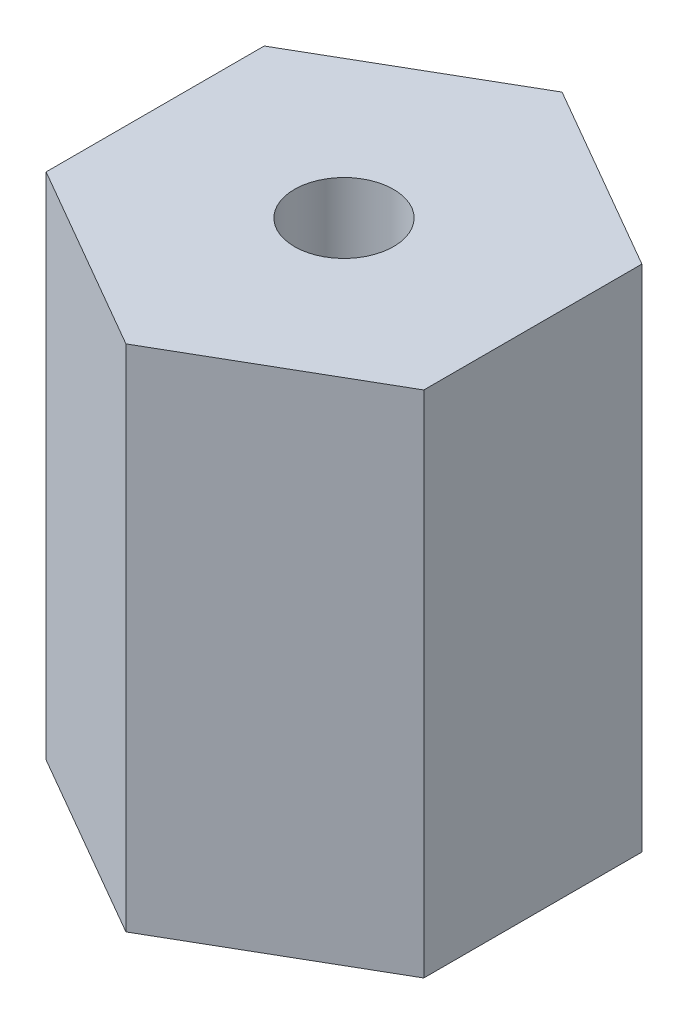
ISO-10303-21;
HEADER;
FILE_DESCRIPTION(('STEP AP214'),'2;1');
FILE_NAME('part.step','',(''),(''),'','','');
FILE_SCHEMA(('AUTOMOTIVE_DESIGN { 1 0 10303 214 1 1 1 1 }'));
ENDSEC;
DATA;
#1=APPLICATION_CONTEXT('core data for automotive mechanical design processes');
#2=APPLICATION_PROTOCOL_DEFINITION('international standard','automotive_design',2000,#1);
#3=PRODUCT_CONTEXT('',#1,'mechanical');
#4=PRODUCT('Part','Part','',(#3));
#5=PRODUCT_RELATED_PRODUCT_CATEGORY('part','',(#4));
#6=PRODUCT_DEFINITION_FORMATION('','',#4);
#7=PRODUCT_DEFINITION_CONTEXT('part definition',#1,'design');
#8=PRODUCT_DEFINITION('design','',#6,#7);
#9=PRODUCT_DEFINITION_SHAPE('','',#8);
#10=(LENGTH_UNIT() NAMED_UNIT(*) SI_UNIT(.MILLI.,.METRE.));
#11=(NAMED_UNIT(*) PLANE_ANGLE_UNIT() SI_UNIT($,.RADIAN.));
#12=(NAMED_UNIT(*) SI_UNIT($,.STERADIAN.) SOLID_ANGLE_UNIT());
#13=UNCERTAINTY_MEASURE_WITH_UNIT(LENGTH_MEASURE(1.E-05),#10,'distance_accuracy_value','');
#14=(GEOMETRIC_REPRESENTATION_CONTEXT(3) GLOBAL_UNCERTAINTY_ASSIGNED_CONTEXT((#13)) GLOBAL_UNIT_ASSIGNED_CONTEXT((#10,
#11,#12)) REPRESENTATION_CONTEXT('',''));
#15=CARTESIAN_POINT('',(0.,0.,0.));
#16=DIRECTION('',(0.,0.,1.));
#17=DIRECTION('',(1.,0.,0.));
#18=AXIS2_PLACEMENT_3D('',#15,#16,#17);
#19=CARTESIAN_POINT('',(2.2606,6.096,1.30515801853007));
#20=DIRECTION('',(-1.,0.,0.));
#21=DIRECTION('',(0.,0.,1.));
#22=AXIS2_PLACEMENT_3D('',#19,#20,#21);
#23=PLANE('',#22);
#24=DIRECTION('',(0.,0.,-1.));
#25=VECTOR('',#24,1.);
#26=CARTESIAN_POINT('',(2.2606,0.,1.30515801853007));
#27=LINE('',#26,#25);
#28=CARTESIAN_POINT('',(2.2606,0.,1.30515801853007));
#29=VERTEX_POINT('',#28);
#30=CARTESIAN_POINT('',(2.2606,0.,-1.30515801853007));
#31=VERTEX_POINT('',#30);
#32=EDGE_CURVE('E117',#29,#31,#27,.T.);
#33=ORIENTED_EDGE('',*,*,#32,.T.);
#34=DIRECTION('',(0.,-1.,0.));
#35=VECTOR('',#34,1.);
#36=CARTESIAN_POINT('',(2.2606,6.096,-1.30515801853007));
#37=LINE('',#36,#35);
#38=CARTESIAN_POINT('',(2.2606,6.096,-1.30515801853007));
#39=VERTEX_POINT('',#38);
#40=EDGE_CURVE('E11',#39,#31,#37,.T.);
#41=ORIENTED_EDGE('',*,*,#40,.F.);
#42=DIRECTION('',(0.,0.,-1.));
#43=VECTOR('',#42,1.);
#44=CARTESIAN_POINT('',(2.2606,6.096,1.30515801853007));
#45=LINE('',#44,#43);
#46=CARTESIAN_POINT('',(2.2606,6.096,1.30515801853007));
#47=VERTEX_POINT('',#46);
#48=EDGE_CURVE('E128',#47,#39,#45,.T.);
#49=ORIENTED_EDGE('',*,*,#48,.F.);
#50=DIRECTION('',(0.,-1.,0.));
#51=VECTOR('',#50,1.);
#52=CARTESIAN_POINT('',(2.2606,6.096,1.30515801853007));
#53=LINE('',#52,#51);
#54=EDGE_CURVE('E113',#47,#29,#53,.T.);
#55=ORIENTED_EDGE('',*,*,#54,.T.);
#56=EDGE_LOOP('',(#33,#41,#49,#55));
#57=FACE_BOUND('',#56,.T.);
#58=ADVANCED_FACE('F33',(#57),#23,.F.);
#59=CARTESIAN_POINT('',(2.2606,6.096,-1.30515801853007));
#60=DIRECTION('',(-0.5,0.,0.866025403784439));
#61=DIRECTION('',(0.866025403784439,0.,0.5));
#62=AXIS2_PLACEMENT_3D('',#59,#60,#61);
#63=PLANE('',#62);
#64=DIRECTION('',(-0.866025403784439,0.,-0.5));
#65=VECTOR('',#64,1.);
#66=CARTESIAN_POINT('',(2.2606,0.,-1.30515801853007));
#67=LINE('',#66,#65);
#68=CARTESIAN_POINT('',(0.,0.,-2.61031603706014));
#69=VERTEX_POINT('',#68);
#70=EDGE_CURVE('E120',#31,#69,#67,.T.);
#71=ORIENTED_EDGE('',*,*,#70,.T.);
#72=DIRECTION('',(0.,-1.,0.));
#73=VECTOR('',#72,1.);
#74=CARTESIAN_POINT('',(0.,6.096,-2.61031603706014));
#75=LINE('',#74,#73);
#76=CARTESIAN_POINT('',(0.,6.096,-2.61031603706014));
#77=VERTEX_POINT('',#76);
#78=EDGE_CURVE('E41',#77,#69,#75,.T.);
#79=ORIENTED_EDGE('',*,*,#78,.F.);
#80=DIRECTION('',(-0.866025403784439,0.,-0.5));
#81=VECTOR('',#80,1.);
#82=CARTESIAN_POINT('',(2.2606,6.096,-1.30515801853007));
#83=LINE('',#82,#81);
#84=EDGE_CURVE('E86',#39,#77,#83,.T.);
#85=ORIENTED_EDGE('',*,*,#84,.F.);
#86=ORIENTED_EDGE('',*,*,#40,.T.);
#87=EDGE_LOOP('',(#71,#79,#85,#86));
#88=FACE_BOUND('',#87,.T.);
#89=ADVANCED_FACE('F153',(#88),#63,.F.);
#90=CARTESIAN_POINT('',(0.,6.096,-2.61031603706014));
#91=DIRECTION('',(0.5,0.,0.866025403784439));
#92=DIRECTION('',(0.866025403784439,0.,-0.5));
#93=AXIS2_PLACEMENT_3D('',#90,#91,#92);
#94=PLANE('',#93);
#95=DIRECTION('',(-0.866025403784439,0.,0.5));
#96=VECTOR('',#95,1.);
#97=CARTESIAN_POINT('',(0.,0.,-2.61031603706014));
#98=LINE('',#97,#96);
#99=CARTESIAN_POINT('',(-2.2606,0.,-1.30515801853007));
#100=VERTEX_POINT('',#99);
#101=EDGE_CURVE('E123',#69,#100,#98,.T.);
#102=ORIENTED_EDGE('',*,*,#101,.T.);
#103=DIRECTION('',(0.,-1.,0.));
#104=VECTOR('',#103,1.);
#105=CARTESIAN_POINT('',(-2.2606,6.096,-1.30515801853007));
#106=LINE('',#105,#104);
#107=CARTESIAN_POINT('',(-2.2606,6.096,-1.30515801853007));
#108=VERTEX_POINT('',#107);
#109=EDGE_CURVE('E108',#108,#100,#106,.T.);
#110=ORIENTED_EDGE('',*,*,#109,.F.);
#111=DIRECTION('',(-0.866025403784439,0.,0.5));
#112=VECTOR('',#111,1.);
#113=CARTESIAN_POINT('',(0.,6.096,-2.61031603706014));
#114=LINE('',#113,#112);
#115=EDGE_CURVE('E99',#77,#108,#114,.T.);
#116=ORIENTED_EDGE('',*,*,#115,.F.);
#117=ORIENTED_EDGE('',*,*,#78,.T.);
#118=EDGE_LOOP('',(#102,#110,#116,#117));
#119=FACE_BOUND('',#118,.T.);
#120=ADVANCED_FACE('F134',(#119),#94,.F.);
#121=CARTESIAN_POINT('',(-2.2606,6.096,-1.30515801853007));
#122=DIRECTION('',(1.,0.,0.));
#123=DIRECTION('',(0.,0.,-1.));
#124=AXIS2_PLACEMENT_3D('',#121,#122,#123);
#125=PLANE('',#124);
#126=DIRECTION('',(0.,0.,1.));
#127=VECTOR('',#126,1.);
#128=CARTESIAN_POINT('',(-2.2606,0.,-1.30515801853007));
#129=LINE('',#128,#127);
#130=CARTESIAN_POINT('',(-2.2606,0.,1.30515801853007));
#131=VERTEX_POINT('',#130);
#132=EDGE_CURVE('E107',#100,#131,#129,.T.);
#133=ORIENTED_EDGE('',*,*,#132,.T.);
#134=DIRECTION('',(0.,-1.,0.));
#135=VECTOR('',#134,1.);
#136=CARTESIAN_POINT('',(-2.2606,6.096,1.30515801853007));
#137=LINE('',#136,#135);
#138=CARTESIAN_POINT('',(-2.2606,6.096,1.30515801853007));
#139=VERTEX_POINT('',#138);
#140=EDGE_CURVE('E104',#139,#131,#137,.T.);
#141=ORIENTED_EDGE('',*,*,#140,.F.);
#142=DIRECTION('',(0.,0.,1.));
#143=VECTOR('',#142,1.);
#144=CARTESIAN_POINT('',(-2.2606,6.096,-1.30515801853007));
#145=LINE('',#144,#143);
#146=EDGE_CURVE('E93',#108,#139,#145,.T.);
#147=ORIENTED_EDGE('',*,*,#146,.F.);
#148=ORIENTED_EDGE('',*,*,#109,.T.);
#149=EDGE_LOOP('',(#133,#141,#147,#148));
#150=FACE_BOUND('',#149,.T.);
#151=ADVANCED_FACE('F105',(#150),#125,.F.);
#152=CARTESIAN_POINT('',(-2.2606,6.096,1.30515801853007));
#153=DIRECTION('',(0.5,0.,-0.866025403784439));
#154=DIRECTION('',(-0.866025403784439,0.,-0.5));
#155=AXIS2_PLACEMENT_3D('',#152,#153,#154);
#156=PLANE('',#155);
#157=DIRECTION('',(0.866025403784439,0.,0.5));
#158=VECTOR('',#157,1.);
#159=CARTESIAN_POINT('',(-2.2606,0.,1.30515801853007));
#160=LINE('',#159,#158);
#161=CARTESIAN_POINT('',(0.,0.,2.61031603706014));
#162=VERTEX_POINT('',#161);
#163=EDGE_CURVE('E72',#131,#162,#160,.T.);
#164=ORIENTED_EDGE('',*,*,#163,.T.);
#165=DIRECTION('',(0.,-1.,0.));
#166=VECTOR('',#165,1.);
#167=CARTESIAN_POINT('',(0.,6.096,2.61031603706014));
#168=LINE('',#167,#166);
#169=CARTESIAN_POINT('',(0.,6.096,2.61031603706014));
#170=VERTEX_POINT('',#169);
#171=EDGE_CURVE('E109',#170,#162,#168,.T.);
#172=ORIENTED_EDGE('',*,*,#171,.F.);
#173=DIRECTION('',(0.866025403784439,0.,0.5));
#174=VECTOR('',#173,1.);
#175=CARTESIAN_POINT('',(-2.2606,6.096,1.30515801853007));
#176=LINE('',#175,#174);
#177=EDGE_CURVE('E97',#139,#170,#176,.T.);
#178=ORIENTED_EDGE('',*,*,#177,.F.);
#179=ORIENTED_EDGE('',*,*,#140,.T.);
#180=EDGE_LOOP('',(#164,#172,#178,#179));
#181=FACE_BOUND('',#180,.T.);
#182=ADVANCED_FACE('F111',(#181),#156,.F.);
#183=CARTESIAN_POINT('',(0.,6.096,2.61031603706014));
#184=DIRECTION('',(-0.5,0.,-0.866025403784438));
#185=DIRECTION('',(-0.866025403784439,0.,0.5));
#186=AXIS2_PLACEMENT_3D('',#183,#184,#185);
#187=PLANE('',#186);
#188=DIRECTION('',(0.866025403784438,0.,-0.5));
#189=VECTOR('',#188,1.);
#190=CARTESIAN_POINT('',(0.,0.,2.61031603706014));
#191=LINE('',#190,#189);
#192=EDGE_CURVE('E78',#162,#29,#191,.T.);
#193=ORIENTED_EDGE('',*,*,#192,.T.);
#194=ORIENTED_EDGE('',*,*,#54,.F.);
#195=DIRECTION('',(0.866025403784438,0.,-0.5));
#196=VECTOR('',#195,1.);
#197=CARTESIAN_POINT('',(0.,6.096,2.61031603706014));
#198=LINE('',#197,#196);
#199=EDGE_CURVE('E49',#170,#47,#198,.T.);
#200=ORIENTED_EDGE('',*,*,#199,.F.);
#201=ORIENTED_EDGE('',*,*,#171,.T.);
#202=EDGE_LOOP('',(#193,#194,#200,#201));
#203=FACE_BOUND('',#202,.T.);
#204=ADVANCED_FACE('F141',(#203),#187,.F.);
#205=CARTESIAN_POINT('',(2.2606,6.096,-1.30515801853007));
#206=DIRECTION('',(0.,1.,0.));
#207=DIRECTION('',(0.,0.,1.));
#208=AXIS2_PLACEMENT_3D('',#205,#206,#207);
#209=PLANE('',#208);
#210=CARTESIAN_POINT('',(0.,6.096,0.));
#211=DIRECTION('',(0.,1.,0.));
#212=DIRECTION('',(0.,0.,1.));
#213=AXIS2_PLACEMENT_3D('',#210,#211,#212);
#214=CIRCLE('',#213,0.593671867306966);
#215=CARTESIAN_POINT('',(0.,6.096,0.593671867306966));
#216=VERTEX_POINT('',#215);
#217=EDGE_CURVE('E208',#216,#216,#214,.T.);
#218=ORIENTED_EDGE('',*,*,#217,.F.);
#219=EDGE_LOOP('',(#218));
#220=FACE_BOUND('',#219,.T.);
#221=ORIENTED_EDGE('',*,*,#48,.T.);
#222=ORIENTED_EDGE('',*,*,#84,.T.);
#223=ORIENTED_EDGE('',*,*,#115,.T.);
#224=ORIENTED_EDGE('',*,*,#146,.T.);
#225=ORIENTED_EDGE('',*,*,#177,.T.);
#226=ORIENTED_EDGE('',*,*,#199,.T.);
#227=EDGE_LOOP('',(#221,#222,#223,#224,#225,#226));
#228=FACE_BOUND('',#227,.T.);
#229=ADVANCED_FACE('F95',(#220,#228),#209,.T.);
#230=CARTESIAN_POINT('',(2.2606,0.,-1.30515801853007));
#231=DIRECTION('',(0.,1.,0.));
#232=DIRECTION('',(0.,0.,1.));
#233=AXIS2_PLACEMENT_3D('',#230,#231,#232);
#234=PLANE('',#233);
#235=CARTESIAN_POINT('',(0.,0.,0.));
#236=DIRECTION('',(0.,1.,0.));
#237=DIRECTION('',(0.,0.,1.));
#238=AXIS2_PLACEMENT_3D('',#235,#236,#237);
#239=CIRCLE('',#238,0.593671867306966);
#240=CARTESIAN_POINT('',(0.,0.,0.593671867306966));
#241=VERTEX_POINT('',#240);
#242=EDGE_CURVE('E121',#241,#241,#239,.T.);
#243=ORIENTED_EDGE('',*,*,#242,.T.);
#244=EDGE_LOOP('',(#243));
#245=FACE_BOUND('',#244,.T.);
#246=ORIENTED_EDGE('',*,*,#32,.F.);
#247=ORIENTED_EDGE('',*,*,#192,.F.);
#248=ORIENTED_EDGE('',*,*,#163,.F.);
#249=ORIENTED_EDGE('',*,*,#132,.F.);
#250=ORIENTED_EDGE('',*,*,#101,.F.);
#251=ORIENTED_EDGE('',*,*,#70,.F.);
#252=EDGE_LOOP('',(#246,#247,#248,#249,#250,#251));
#253=FACE_BOUND('',#252,.T.);
#254=ADVANCED_FACE('F137',(#245,#253),#234,.F.);
#255=CARTESIAN_POINT('',(0.,0.,0.));
#256=DIRECTION('',(0.,1.,0.));
#257=DIRECTION('',(0.,0.,1.));
#258=AXIS2_PLACEMENT_3D('',#255,#256,#257);
#259=CYLINDRICAL_SURFACE('',#258,0.593671867306966);
#260=ORIENTED_EDGE('',*,*,#242,.F.);
#261=EDGE_LOOP('',(#260));
#262=FACE_BOUND('',#261,.T.);
#263=ORIENTED_EDGE('',*,*,#217,.T.);
#264=EDGE_LOOP('',(#263));
#265=FACE_BOUND('',#264,.T.);
#266=ADVANCED_FACE('F190',(#262,#265),#259,.F.);
#267=CLOSED_SHELL('',(#58,#89,#120,#151,#182,#204,#229,#254,#266));
#268=MANIFOLD_SOLID_BREP('B2',#267);
#269=ADVANCED_BREP_SHAPE_REPRESENTATION('',(#18,#268),#14);
#270=SHAPE_DEFINITION_REPRESENTATION(#9,#269);
ENDSEC;
END-ISO-10303-21;
